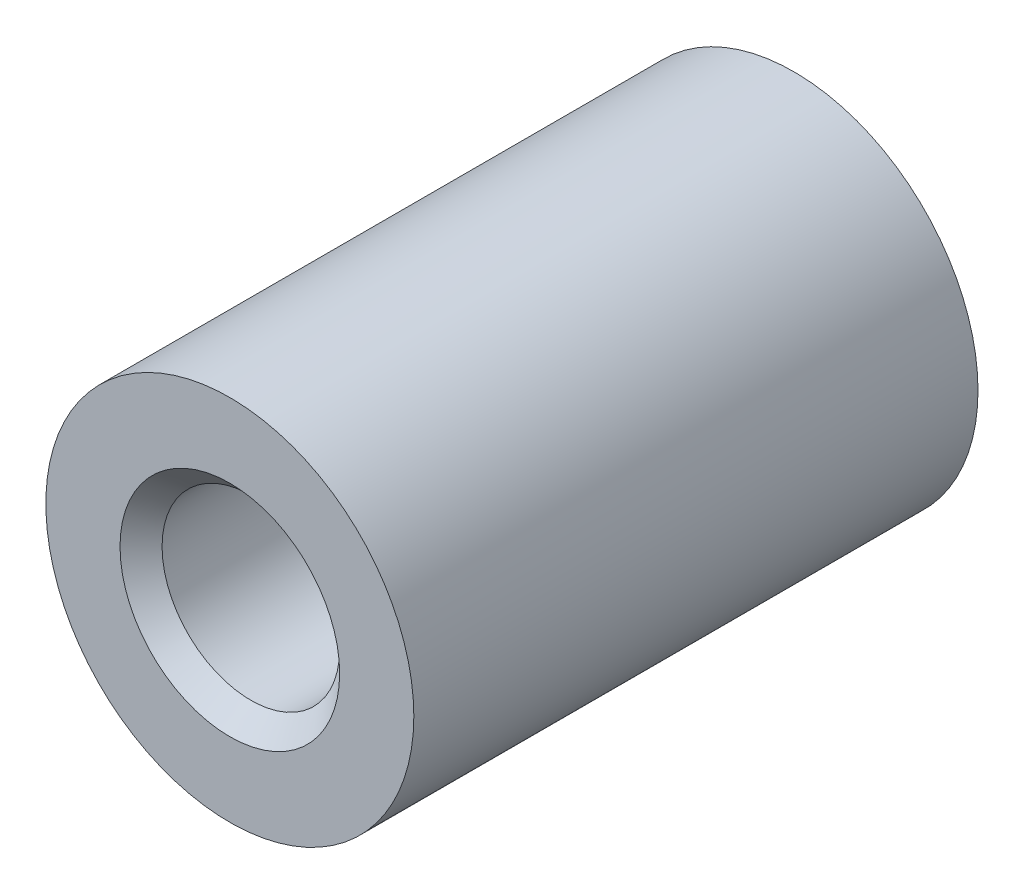
ISO-10303-21;
HEADER;
FILE_DESCRIPTION(('STEP AP214'),'2;1');
FILE_NAME('part.step','',(''),(''),'','','');
FILE_SCHEMA(('AUTOMOTIVE_DESIGN { 1 0 10303 214 1 1 1 1 }'));
ENDSEC;
DATA;
#1=APPLICATION_CONTEXT('core data for automotive mechanical design processes');
#2=APPLICATION_PROTOCOL_DEFINITION('international standard','automotive_design',2000,#1);
#3=PRODUCT_CONTEXT('',#1,'mechanical');
#4=PRODUCT('Part','Part','',(#3));
#5=PRODUCT_RELATED_PRODUCT_CATEGORY('part','',(#4));
#6=PRODUCT_DEFINITION_FORMATION('','',#4);
#7=PRODUCT_DEFINITION_CONTEXT('part definition',#1,'design');
#8=PRODUCT_DEFINITION('design','',#6,#7);
#9=PRODUCT_DEFINITION_SHAPE('','',#8);
#10=(LENGTH_UNIT() NAMED_UNIT(*) SI_UNIT(.MILLI.,.METRE.));
#11=(NAMED_UNIT(*) PLANE_ANGLE_UNIT() SI_UNIT($,.RADIAN.));
#12=(NAMED_UNIT(*) SI_UNIT($,.STERADIAN.) SOLID_ANGLE_UNIT());
#13=UNCERTAINTY_MEASURE_WITH_UNIT(LENGTH_MEASURE(1.E-05),#10,'distance_accuracy_value','');
#14=(GEOMETRIC_REPRESENTATION_CONTEXT(3) GLOBAL_UNCERTAINTY_ASSIGNED_CONTEXT((#13)) GLOBAL_UNIT_ASSIGNED_CONTEXT((#10,
#11,#12)) REPRESENTATION_CONTEXT('',''));
#15=CARTESIAN_POINT('',(0.,0.,0.));
#16=DIRECTION('',(0.,0.,1.));
#17=DIRECTION('',(1.,0.,0.));
#18=AXIS2_PLACEMENT_3D('',#15,#16,#17);
#19=CARTESIAN_POINT('',(0.,0.,18.52));
#20=DIRECTION('',(0.,0.,-1.));
#21=DIRECTION('',(-1.,0.,0.));
#22=AXIS2_PLACEMENT_3D('',#19,#20,#21);
#23=CYLINDRICAL_SURFACE('',#22,6.04);
#24=CARTESIAN_POINT('',(0.,0.,18.52));
#25=DIRECTION('',(0.,0.,1.));
#26=DIRECTION('',(1.,0.,0.));
#27=AXIS2_PLACEMENT_3D('',#24,#25,#26);
#28=CIRCLE('',#27,6.04);
#29=CARTESIAN_POINT('',(6.04,0.,18.52));
#30=VERTEX_POINT('',#29);
#31=EDGE_CURVE('E61',#30,#30,#28,.T.);
#32=ORIENTED_EDGE('',*,*,#31,.F.);
#33=EDGE_LOOP('',(#32));
#34=FACE_BOUND('',#33,.T.);
#35=CARTESIAN_POINT('',(0.,0.,0.));
#36=DIRECTION('',(0.,0.,1.));
#37=DIRECTION('',(1.,0.,0.));
#38=AXIS2_PLACEMENT_3D('',#35,#36,#37);
#39=CIRCLE('',#38,6.04);
#40=CARTESIAN_POINT('',(6.04,0.,0.));
#41=VERTEX_POINT('',#40);
#42=EDGE_CURVE('E62',#41,#41,#39,.T.);
#43=ORIENTED_EDGE('',*,*,#42,.T.);
#44=EDGE_LOOP('',(#43));
#45=FACE_BOUND('',#44,.T.);
#46=ADVANCED_FACE('F37',(#34,#45),#23,.T.);
#47=CARTESIAN_POINT('',(0.,0.,18.52));
#48=DIRECTION('',(0.,0.,1.));
#49=DIRECTION('',(1.,0.,0.));
#50=AXIS2_PLACEMENT_3D('',#47,#48,#49);
#51=PLANE('',#50);
#52=CARTESIAN_POINT('',(0.,0.,18.52));
#53=DIRECTION('',(0.,0.,1.));
#54=DIRECTION('',(1.,0.,0.));
#55=AXIS2_PLACEMENT_3D('',#52,#53,#54);
#56=CIRCLE('',#55,3.605);
#57=CARTESIAN_POINT('',(3.605,0.,18.52));
#58=VERTEX_POINT('',#57);
#59=EDGE_CURVE('E50',#58,#58,#56,.F.);
#60=ORIENTED_EDGE('',*,*,#59,.T.);
#61=EDGE_LOOP('',(#60));
#62=FACE_BOUND('',#61,.T.);
#63=ORIENTED_EDGE('',*,*,#31,.T.);
#64=EDGE_LOOP('',(#63));
#65=FACE_BOUND('',#64,.T.);
#66=ADVANCED_FACE('F70',(#62,#65),#51,.T.);
#67=CARTESIAN_POINT('',(0.,0.,0.));
#68=DIRECTION('',(0.,0.,1.));
#69=DIRECTION('',(1.,0.,0.));
#70=AXIS2_PLACEMENT_3D('',#67,#68,#69);
#71=PLANE('',#70);
#72=CARTESIAN_POINT('',(0.,0.,0.));
#73=DIRECTION('',(0.,0.,1.));
#74=DIRECTION('',(1.,0.,0.));
#75=AXIS2_PLACEMENT_3D('',#72,#73,#74);
#76=CIRCLE('',#75,3.605);
#77=CARTESIAN_POINT('',(3.605,0.,0.));
#78=VERTEX_POINT('',#77);
#79=EDGE_CURVE('E45',#78,#78,#76,.T.);
#80=ORIENTED_EDGE('',*,*,#79,.T.);
#81=EDGE_LOOP('',(#80));
#82=FACE_BOUND('',#81,.T.);
#83=ORIENTED_EDGE('',*,*,#42,.F.);
#84=EDGE_LOOP('',(#83));
#85=FACE_BOUND('',#84,.T.);
#86=ADVANCED_FACE('F77',(#82,#85),#71,.F.);
#87=CARTESIAN_POINT('',(0.,0.,0.));
#88=DIRECTION('',(0.,0.,1.));
#89=DIRECTION('',(1.,0.,0.));
#90=AXIS2_PLACEMENT_3D('',#87,#88,#89);
#91=CYLINDRICAL_SURFACE('',#90,2.915);
#92=CARTESIAN_POINT('',(0.,0.,0.690000000000004));
#93=DIRECTION('',(0.,0.,1.));
#94=DIRECTION('',(1.,0.,0.));
#95=AXIS2_PLACEMENT_3D('',#92,#93,#94);
#96=CIRCLE('',#95,2.915);
#97=CARTESIAN_POINT('',(2.915,0.,0.690000000000004));
#98=VERTEX_POINT('',#97);
#99=EDGE_CURVE('E10',#98,#98,#96,.F.);
#100=ORIENTED_EDGE('',*,*,#99,.T.);
#101=EDGE_LOOP('',(#100));
#102=FACE_BOUND('',#101,.T.);
#103=CARTESIAN_POINT('',(0.,0.,17.83));
#104=DIRECTION('',(0.,0.,1.));
#105=DIRECTION('',(1.,0.,0.));
#106=AXIS2_PLACEMENT_3D('',#103,#104,#105);
#107=CIRCLE('',#106,2.915);
#108=CARTESIAN_POINT('',(2.915,0.,17.83));
#109=VERTEX_POINT('',#108);
#110=EDGE_CURVE('E55',#109,#109,#107,.T.);
#111=ORIENTED_EDGE('',*,*,#110,.T.);
#112=EDGE_LOOP('',(#111));
#113=FACE_BOUND('',#112,.T.);
#114=ADVANCED_FACE('F79',(#102,#113),#91,.F.);
#115=CARTESIAN_POINT('',(0.,0.,17.83));
#116=DIRECTION('',(0.,0.,1.));
#117=DIRECTION('',(1.,0.,0.));
#118=AXIS2_PLACEMENT_3D('',#115,#116,#117);
#119=CONICAL_SURFACE('',#118,2.915,0.785398163397451);
#120=ORIENTED_EDGE('',*,*,#59,.F.);
#121=EDGE_LOOP('',(#120));
#122=FACE_BOUND('',#121,.T.);
#123=ORIENTED_EDGE('',*,*,#110,.F.);
#124=EDGE_LOOP('',(#123));
#125=FACE_BOUND('',#124,.T.);
#126=ADVANCED_FACE('F85',(#122,#125),#119,.F.);
#127=CARTESIAN_POINT('',(0.,0.,0.));
#128=DIRECTION('',(0.,0.,-1.));
#129=DIRECTION('',(-1.,0.,0.));
#130=AXIS2_PLACEMENT_3D('',#127,#128,#129);
#131=CONICAL_SURFACE('',#130,3.605,0.785398163397446);
#132=ORIENTED_EDGE('',*,*,#99,.F.);
#133=EDGE_LOOP('',(#132));
#134=FACE_BOUND('',#133,.T.);
#135=ORIENTED_EDGE('',*,*,#79,.F.);
#136=EDGE_LOOP('',(#135));
#137=FACE_BOUND('',#136,.T.);
#138=ADVANCED_FACE('F39',(#134,#137),#131,.F.);
#139=CLOSED_SHELL('',(#46,#66,#86,#114,#126,#138));
#140=MANIFOLD_SOLID_BREP('B2',#139);
#141=ADVANCED_BREP_SHAPE_REPRESENTATION('',(#18,#140),#14);
#142=SHAPE_DEFINITION_REPRESENTATION(#9,#141);
ENDSEC;
END-ISO-10303-21;
